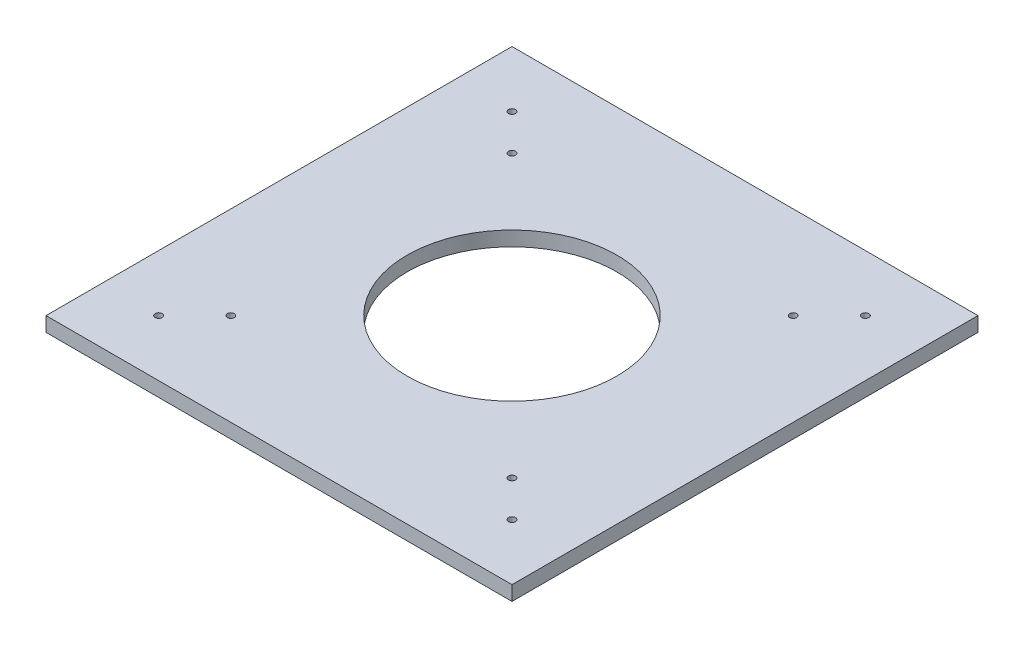
ISO-10303-21;
HEADER;
FILE_DESCRIPTION(('STEP AP214'),'2;1');
FILE_NAME('part.step','',(''),(''),'','','');
FILE_SCHEMA(('AUTOMOTIVE_DESIGN { 1 0 10303 214 1 1 1 1 }'));
ENDSEC;
DATA;
#1=APPLICATION_CONTEXT('core data for automotive mechanical design processes');
#2=APPLICATION_PROTOCOL_DEFINITION('international standard','automotive_design',2000,#1);
#3=PRODUCT_CONTEXT('',#1,'mechanical');
#4=PRODUCT('Part','Part','',(#3));
#5=PRODUCT_RELATED_PRODUCT_CATEGORY('part','',(#4));
#6=PRODUCT_DEFINITION_FORMATION('','',#4);
#7=PRODUCT_DEFINITION_CONTEXT('part definition',#1,'design');
#8=PRODUCT_DEFINITION('design','',#6,#7);
#9=PRODUCT_DEFINITION_SHAPE('','',#8);
#10=(LENGTH_UNIT() NAMED_UNIT(*) SI_UNIT(.MILLI.,.METRE.));
#11=(NAMED_UNIT(*) PLANE_ANGLE_UNIT() SI_UNIT($,.RADIAN.));
#12=(NAMED_UNIT(*) SI_UNIT($,.STERADIAN.) SOLID_ANGLE_UNIT());
#13=UNCERTAINTY_MEASURE_WITH_UNIT(LENGTH_MEASURE(1.E-05),#10,'distance_accuracy_value','');
#14=(GEOMETRIC_REPRESENTATION_CONTEXT(3) GLOBAL_UNCERTAINTY_ASSIGNED_CONTEXT((#13)) GLOBAL_UNIT_ASSIGNED_CONTEXT((#10,
#11,#12)) REPRESENTATION_CONTEXT('',''));
#15=CARTESIAN_POINT('',(0.,0.,0.));
#16=DIRECTION('',(0.,0.,1.));
#17=DIRECTION('',(1.,0.,0.));
#18=AXIS2_PLACEMENT_3D('',#15,#16,#17);
#19=CARTESIAN_POINT('',(0.,5.,0.));
#20=DIRECTION('',(0.,-1.,0.));
#21=DIRECTION('',(0.,0.,-1.));
#22=AXIS2_PLACEMENT_3D('',#19,#20,#21);
#23=PLANE('',#22);
#24=DIRECTION('',(0.,0.,-1.));
#25=VECTOR('',#24,1.);
#26=CARTESIAN_POINT('',(80.,5.,80.));
#27=LINE('',#26,#25);
#28=CARTESIAN_POINT('',(80.,5.,80.));
#29=VERTEX_POINT('',#28);
#30=CARTESIAN_POINT('',(80.,5.,-80.));
#31=VERTEX_POINT('',#30);
#32=EDGE_CURVE('E85',#29,#31,#27,.T.);
#33=ORIENTED_EDGE('',*,*,#32,.T.);
#34=DIRECTION('',(-1.,0.,0.));
#35=VECTOR('',#34,1.);
#36=CARTESIAN_POINT('',(-80.,5.,-80.));
#37=LINE('',#36,#35);
#38=CARTESIAN_POINT('',(-80.,5.,-80.));
#39=VERTEX_POINT('',#38);
#40=EDGE_CURVE('E80',#31,#39,#37,.T.);
#41=ORIENTED_EDGE('',*,*,#40,.T.);
#42=DIRECTION('',(0.,0.,1.));
#43=VECTOR('',#42,1.);
#44=CARTESIAN_POINT('',(-80.,5.,80.));
#45=LINE('',#44,#43);
#46=CARTESIAN_POINT('',(-80.,5.,80.));
#47=VERTEX_POINT('',#46);
#48=EDGE_CURVE('E83',#39,#47,#45,.T.);
#49=ORIENTED_EDGE('',*,*,#48,.T.);
#50=DIRECTION('',(1.,0.,0.));
#51=VECTOR('',#50,1.);
#52=CARTESIAN_POINT('',(-80.,5.,80.));
#53=LINE('',#52,#51);
#54=EDGE_CURVE('E50',#47,#29,#53,.T.);
#55=ORIENTED_EDGE('',*,*,#54,.T.);
#56=EDGE_LOOP('',(#33,#41,#49,#55));
#57=FACE_BOUND('',#56,.T.);
#58=CARTESIAN_POINT('',(-60.6642066420664,5.,-60.6642066420664));
#59=DIRECTION('',(0.,1.,0.));
#60=DIRECTION('',(0.,0.,1.));
#61=AXIS2_PLACEMENT_3D('',#58,#59,#60);
#62=CIRCLE('',#61,1.2);
#63=CARTESIAN_POINT('',(-60.6642066420664,5.,-59.4642066420664));
#64=VERTEX_POINT('',#63);
#65=EDGE_CURVE('E100',#64,#64,#62,.T.);
#66=ORIENTED_EDGE('',*,*,#65,.F.);
#67=EDGE_LOOP('',(#66));
#68=FACE_BOUND('',#67,.T.);
#69=CARTESIAN_POINT('',(-48.2795521345399,5.,-48.2795521345399));
#70=DIRECTION('',(0.,1.,0.));
#71=DIRECTION('',(0.,0.,1.));
#72=AXIS2_PLACEMENT_3D('',#69,#70,#71);
#73=CIRCLE('',#72,1.2);
#74=CARTESIAN_POINT('',(-48.2795521345399,5.,-47.0795521345399));
#75=VERTEX_POINT('',#74);
#76=EDGE_CURVE('E115',#75,#75,#73,.T.);
#77=ORIENTED_EDGE('',*,*,#76,.F.);
#78=EDGE_LOOP('',(#77));
#79=FACE_BOUND('',#78,.T.);
#80=CARTESIAN_POINT('',(48.2795521345399,5.,-48.2795521345399));
#81=DIRECTION('',(0.,1.,0.));
#82=DIRECTION('',(0.,0.,-1.));
#83=AXIS2_PLACEMENT_3D('',#80,#81,#82);
#84=CIRCLE('',#83,1.2);
#85=CARTESIAN_POINT('',(48.2795521345399,5.,-49.4795521345399));
#86=VERTEX_POINT('',#85);
#87=EDGE_CURVE('E121',#86,#86,#84,.T.);
#88=ORIENTED_EDGE('',*,*,#87,.F.);
#89=EDGE_LOOP('',(#88));
#90=FACE_BOUND('',#89,.T.);
#91=CARTESIAN_POINT('',(60.6642066420665,5.,-60.6642066420664));
#92=DIRECTION('',(0.,1.,0.));
#93=DIRECTION('',(0.,0.,-1.));
#94=AXIS2_PLACEMENT_3D('',#91,#92,#93);
#95=CIRCLE('',#94,1.2);
#96=CARTESIAN_POINT('',(60.6642066420665,5.,-61.8642066420664));
#97=VERTEX_POINT('',#96);
#98=EDGE_CURVE('E127',#97,#97,#95,.T.);
#99=ORIENTED_EDGE('',*,*,#98,.F.);
#100=EDGE_LOOP('',(#99));
#101=FACE_BOUND('',#100,.T.);
#102=CARTESIAN_POINT('',(60.6642066420665,5.,60.6642066420664));
#103=DIRECTION('',(0.,1.,0.));
#104=DIRECTION('',(0.,0.,1.));
#105=AXIS2_PLACEMENT_3D('',#102,#103,#104);
#106=CIRCLE('',#105,1.2);
#107=CARTESIAN_POINT('',(60.6642066420665,5.,61.8642066420664));
#108=VERTEX_POINT('',#107);
#109=EDGE_CURVE('E133',#108,#108,#106,.T.);
#110=ORIENTED_EDGE('',*,*,#109,.F.);
#111=EDGE_LOOP('',(#110));
#112=FACE_BOUND('',#111,.T.);
#113=CARTESIAN_POINT('',(48.2795521345399,5.,48.2795521345398));
#114=DIRECTION('',(0.,1.,0.));
#115=DIRECTION('',(0.,0.,1.));
#116=AXIS2_PLACEMENT_3D('',#113,#114,#115);
#117=CIRCLE('',#116,1.2);
#118=CARTESIAN_POINT('',(48.2795521345399,5.,49.4795521345398));
#119=VERTEX_POINT('',#118);
#120=EDGE_CURVE('E139',#119,#119,#117,.T.);
#121=ORIENTED_EDGE('',*,*,#120,.F.);
#122=EDGE_LOOP('',(#121));
#123=FACE_BOUND('',#122,.T.);
#124=CARTESIAN_POINT('',(-48.2795521345399,5.,48.2795521345399));
#125=DIRECTION('',(0.,1.,0.));
#126=DIRECTION('',(0.,0.,-1.));
#127=AXIS2_PLACEMENT_3D('',#124,#125,#126);
#128=CIRCLE('',#127,1.2);
#129=CARTESIAN_POINT('',(-48.2795521345399,5.,47.0795521345399));
#130=VERTEX_POINT('',#129);
#131=EDGE_CURVE('E145',#130,#130,#128,.T.);
#132=ORIENTED_EDGE('',*,*,#131,.F.);
#133=EDGE_LOOP('',(#132));
#134=FACE_BOUND('',#133,.T.);
#135=CARTESIAN_POINT('',(-60.6642066420664,5.,60.6642066420664));
#136=DIRECTION('',(0.,1.,0.));
#137=DIRECTION('',(0.,0.,-1.));
#138=AXIS2_PLACEMENT_3D('',#135,#136,#137);
#139=CIRCLE('',#138,1.2);
#140=CARTESIAN_POINT('',(-60.6642066420664,5.,59.4642066420664));
#141=VERTEX_POINT('',#140);
#142=EDGE_CURVE('E151',#141,#141,#139,.T.);
#143=ORIENTED_EDGE('',*,*,#142,.F.);
#144=EDGE_LOOP('',(#143));
#145=FACE_BOUND('',#144,.T.);
#146=CARTESIAN_POINT('',(0.,5.,0.));
#147=DIRECTION('',(0.,1.,0.));
#148=DIRECTION('',(0.,0.,1.));
#149=AXIS2_PLACEMENT_3D('',#146,#147,#148);
#150=CIRCLE('',#149,36.);
#151=CARTESIAN_POINT('',(0.,5.,36.));
#152=VERTEX_POINT('',#151);
#153=EDGE_CURVE('E157',#152,#152,#150,.T.);
#154=ORIENTED_EDGE('',*,*,#153,.F.);
#155=EDGE_LOOP('',(#154));
#156=FACE_BOUND('',#155,.T.);
#157=ADVANCED_FACE('F33',(#57,#68,#79,#90,#101,#112,#123,#134,#145,#156),#23,.F.);
#158=CARTESIAN_POINT('',(0.,0.,0.));
#159=DIRECTION('',(0.,-1.,0.));
#160=DIRECTION('',(0.,0.,-1.));
#161=AXIS2_PLACEMENT_3D('',#158,#159,#160);
#162=PLANE('',#161);
#163=CARTESIAN_POINT('',(-60.6642066420664,0.,60.6642066420664));
#164=DIRECTION('',(0.,1.,0.));
#165=DIRECTION('',(0.,0.,-1.));
#166=AXIS2_PLACEMENT_3D('',#163,#164,#165);
#167=CIRCLE('',#166,1.2);
#168=CARTESIAN_POINT('',(-60.6642066420664,0.,59.4642066420664));
#169=VERTEX_POINT('',#168);
#170=EDGE_CURVE('E154',#169,#169,#167,.T.);
#171=ORIENTED_EDGE('',*,*,#170,.T.);
#172=EDGE_LOOP('',(#171));
#173=FACE_BOUND('',#172,.T.);
#174=CARTESIAN_POINT('',(48.2795521345399,0.,48.2795521345398));
#175=DIRECTION('',(0.,1.,0.));
#176=DIRECTION('',(0.,0.,1.));
#177=AXIS2_PLACEMENT_3D('',#174,#175,#176);
#178=CIRCLE('',#177,1.2);
#179=CARTESIAN_POINT('',(48.2795521345399,0.,49.4795521345398));
#180=VERTEX_POINT('',#179);
#181=EDGE_CURVE('E142',#180,#180,#178,.T.);
#182=ORIENTED_EDGE('',*,*,#181,.T.);
#183=EDGE_LOOP('',(#182));
#184=FACE_BOUND('',#183,.T.);
#185=CARTESIAN_POINT('',(60.6642066420665,0.,-60.6642066420664));
#186=DIRECTION('',(0.,1.,0.));
#187=DIRECTION('',(0.,0.,-1.));
#188=AXIS2_PLACEMENT_3D('',#185,#186,#187);
#189=CIRCLE('',#188,1.2);
#190=CARTESIAN_POINT('',(60.6642066420665,0.,-61.8642066420664));
#191=VERTEX_POINT('',#190);
#192=EDGE_CURVE('E130',#191,#191,#189,.T.);
#193=ORIENTED_EDGE('',*,*,#192,.T.);
#194=EDGE_LOOP('',(#193));
#195=FACE_BOUND('',#194,.T.);
#196=CARTESIAN_POINT('',(-48.2795521345399,0.,-48.2795521345399));
#197=DIRECTION('',(0.,1.,0.));
#198=DIRECTION('',(0.,0.,1.));
#199=AXIS2_PLACEMENT_3D('',#196,#197,#198);
#200=CIRCLE('',#199,1.2);
#201=CARTESIAN_POINT('',(-48.2795521345399,0.,-47.0795521345399));
#202=VERTEX_POINT('',#201);
#203=EDGE_CURVE('E118',#202,#202,#200,.T.);
#204=ORIENTED_EDGE('',*,*,#203,.T.);
#205=EDGE_LOOP('',(#204));
#206=FACE_BOUND('',#205,.T.);
#207=DIRECTION('',(0.,0.,-1.));
#208=VECTOR('',#207,1.);
#209=CARTESIAN_POINT('',(80.,0.,80.));
#210=LINE('',#209,#208);
#211=CARTESIAN_POINT('',(80.,0.,80.));
#212=VERTEX_POINT('',#211);
#213=CARTESIAN_POINT('',(80.,0.,-80.));
#214=VERTEX_POINT('',#213);
#215=EDGE_CURVE('E97',#212,#214,#210,.T.);
#216=ORIENTED_EDGE('',*,*,#215,.F.);
#217=DIRECTION('',(1.,0.,0.));
#218=VECTOR('',#217,1.);
#219=CARTESIAN_POINT('',(-80.,0.,80.));
#220=LINE('',#219,#218);
#221=CARTESIAN_POINT('',(-80.,0.,80.));
#222=VERTEX_POINT('',#221);
#223=EDGE_CURVE('E73',#222,#212,#220,.T.);
#224=ORIENTED_EDGE('',*,*,#223,.F.);
#225=DIRECTION('',(0.,0.,1.));
#226=VECTOR('',#225,1.);
#227=CARTESIAN_POINT('',(-80.,0.,80.));
#228=LINE('',#227,#226);
#229=CARTESIAN_POINT('',(-80.,0.,-80.));
#230=VERTEX_POINT('',#229);
#231=EDGE_CURVE('E67',#230,#222,#228,.T.);
#232=ORIENTED_EDGE('',*,*,#231,.F.);
#233=DIRECTION('',(-1.,0.,0.));
#234=VECTOR('',#233,1.);
#235=CARTESIAN_POINT('',(-80.,0.,-80.));
#236=LINE('',#235,#234);
#237=EDGE_CURVE('E89',#214,#230,#236,.T.);
#238=ORIENTED_EDGE('',*,*,#237,.F.);
#239=EDGE_LOOP('',(#216,#224,#232,#238));
#240=FACE_BOUND('',#239,.T.);
#241=CARTESIAN_POINT('',(-60.6642066420664,0.,-60.6642066420664));
#242=DIRECTION('',(0.,1.,0.));
#243=DIRECTION('',(0.,0.,1.));
#244=AXIS2_PLACEMENT_3D('',#241,#242,#243);
#245=CIRCLE('',#244,1.2);
#246=CARTESIAN_POINT('',(-60.6642066420664,0.,-59.4642066420664));
#247=VERTEX_POINT('',#246);
#248=EDGE_CURVE('E112',#247,#247,#245,.T.);
#249=ORIENTED_EDGE('',*,*,#248,.T.);
#250=EDGE_LOOP('',(#249));
#251=FACE_BOUND('',#250,.T.);
#252=CARTESIAN_POINT('',(48.2795521345399,0.,-48.2795521345399));
#253=DIRECTION('',(0.,1.,0.));
#254=DIRECTION('',(0.,0.,-1.));
#255=AXIS2_PLACEMENT_3D('',#252,#253,#254);
#256=CIRCLE('',#255,1.2);
#257=CARTESIAN_POINT('',(48.2795521345399,0.,-49.4795521345399));
#258=VERTEX_POINT('',#257);
#259=EDGE_CURVE('E124',#258,#258,#256,.T.);
#260=ORIENTED_EDGE('',*,*,#259,.T.);
#261=EDGE_LOOP('',(#260));
#262=FACE_BOUND('',#261,.T.);
#263=CARTESIAN_POINT('',(60.6642066420665,0.,60.6642066420664));
#264=DIRECTION('',(0.,1.,0.));
#265=DIRECTION('',(0.,0.,1.));
#266=AXIS2_PLACEMENT_3D('',#263,#264,#265);
#267=CIRCLE('',#266,1.2);
#268=CARTESIAN_POINT('',(60.6642066420665,0.,61.8642066420664));
#269=VERTEX_POINT('',#268);
#270=EDGE_CURVE('E136',#269,#269,#267,.T.);
#271=ORIENTED_EDGE('',*,*,#270,.T.);
#272=EDGE_LOOP('',(#271));
#273=FACE_BOUND('',#272,.T.);
#274=CARTESIAN_POINT('',(-48.2795521345399,0.,48.2795521345399));
#275=DIRECTION('',(0.,1.,0.));
#276=DIRECTION('',(0.,0.,-1.));
#277=AXIS2_PLACEMENT_3D('',#274,#275,#276);
#278=CIRCLE('',#277,1.2);
#279=CARTESIAN_POINT('',(-48.2795521345399,0.,47.0795521345399));
#280=VERTEX_POINT('',#279);
#281=EDGE_CURVE('E148',#280,#280,#278,.T.);
#282=ORIENTED_EDGE('',*,*,#281,.T.);
#283=EDGE_LOOP('',(#282));
#284=FACE_BOUND('',#283,.T.);
#285=CARTESIAN_POINT('',(0.,0.,0.));
#286=DIRECTION('',(0.,1.,0.));
#287=DIRECTION('',(0.,0.,1.));
#288=AXIS2_PLACEMENT_3D('',#285,#286,#287);
#289=CIRCLE('',#288,36.);
#290=CARTESIAN_POINT('',(0.,0.,36.));
#291=VERTEX_POINT('',#290);
#292=EDGE_CURVE('E160',#291,#291,#289,.T.);
#293=ORIENTED_EDGE('',*,*,#292,.T.);
#294=EDGE_LOOP('',(#293));
#295=FACE_BOUND('',#294,.T.);
#296=ADVANCED_FACE('F108',(#173,#184,#195,#206,#240,#251,#262,#273,#284,#295),#162,.T.);
#297=CARTESIAN_POINT('',(80.,5.,80.));
#298=DIRECTION('',(-1.,0.,0.));
#299=DIRECTION('',(0.,0.,1.));
#300=AXIS2_PLACEMENT_3D('',#297,#298,#299);
#301=PLANE('',#300);
#302=ORIENTED_EDGE('',*,*,#215,.T.);
#303=DIRECTION('',(0.,-1.,0.));
#304=VECTOR('',#303,1.);
#305=CARTESIAN_POINT('',(80.,5.,-80.));
#306=LINE('',#305,#304);
#307=EDGE_CURVE('E11',#31,#214,#306,.T.);
#308=ORIENTED_EDGE('',*,*,#307,.F.);
#309=ORIENTED_EDGE('',*,*,#32,.F.);
#310=DIRECTION('',(0.,-1.,0.));
#311=VECTOR('',#310,1.);
#312=CARTESIAN_POINT('',(80.,5.,80.));
#313=LINE('',#312,#311);
#314=EDGE_CURVE('E93',#29,#212,#313,.T.);
#315=ORIENTED_EDGE('',*,*,#314,.T.);
#316=EDGE_LOOP('',(#302,#308,#309,#315));
#317=FACE_BOUND('',#316,.T.);
#318=ADVANCED_FACE('F35',(#317),#301,.F.);
#319=CARTESIAN_POINT('',(-80.,5.,-80.));
#320=DIRECTION('',(0.,0.,1.));
#321=DIRECTION('',(1.,0.,0.));
#322=AXIS2_PLACEMENT_3D('',#319,#320,#321);
#323=PLANE('',#322);
#324=ORIENTED_EDGE('',*,*,#237,.T.);
#325=DIRECTION('',(0.,-1.,0.));
#326=VECTOR('',#325,1.);
#327=CARTESIAN_POINT('',(-80.,5.,-80.));
#328=LINE('',#327,#326);
#329=EDGE_CURVE('E42',#39,#230,#328,.T.);
#330=ORIENTED_EDGE('',*,*,#329,.F.);
#331=ORIENTED_EDGE('',*,*,#40,.F.);
#332=ORIENTED_EDGE('',*,*,#307,.T.);
#333=EDGE_LOOP('',(#324,#330,#331,#332));
#334=FACE_BOUND('',#333,.T.);
#335=ADVANCED_FACE('F88',(#334),#323,.F.);
#336=CARTESIAN_POINT('',(-80.,5.,80.));
#337=DIRECTION('',(1.,0.,0.));
#338=DIRECTION('',(0.,0.,-1.));
#339=AXIS2_PLACEMENT_3D('',#336,#337,#338);
#340=PLANE('',#339);
#341=ORIENTED_EDGE('',*,*,#231,.T.);
#342=DIRECTION('',(0.,-1.,0.));
#343=VECTOR('',#342,1.);
#344=CARTESIAN_POINT('',(-80.,5.,80.));
#345=LINE('',#344,#343);
#346=EDGE_CURVE('E90',#47,#222,#345,.T.);
#347=ORIENTED_EDGE('',*,*,#346,.F.);
#348=ORIENTED_EDGE('',*,*,#48,.F.);
#349=ORIENTED_EDGE('',*,*,#329,.T.);
#350=EDGE_LOOP('',(#341,#347,#348,#349));
#351=FACE_BOUND('',#350,.T.);
#352=ADVANCED_FACE('F91',(#351),#340,.F.);
#353=CARTESIAN_POINT('',(-80.,5.,80.));
#354=DIRECTION('',(0.,0.,-1.));
#355=DIRECTION('',(-1.,0.,0.));
#356=AXIS2_PLACEMENT_3D('',#353,#354,#355);
#357=PLANE('',#356);
#358=ORIENTED_EDGE('',*,*,#223,.T.);
#359=ORIENTED_EDGE('',*,*,#314,.F.);
#360=ORIENTED_EDGE('',*,*,#54,.F.);
#361=ORIENTED_EDGE('',*,*,#346,.T.);
#362=EDGE_LOOP('',(#358,#359,#360,#361));
#363=FACE_BOUND('',#362,.T.);
#364=ADVANCED_FACE('F105',(#363),#357,.F.);
#365=CARTESIAN_POINT('',(-60.6642066420664,5.,-60.6642066420664));
#366=DIRECTION('',(0.,-1.,0.));
#367=DIRECTION('',(0.,0.,-1.));
#368=AXIS2_PLACEMENT_3D('',#365,#366,#367);
#369=CYLINDRICAL_SURFACE('',#368,1.2);
#370=ORIENTED_EDGE('',*,*,#65,.T.);
#371=EDGE_LOOP('',(#370));
#372=FACE_BOUND('',#371,.T.);
#373=ORIENTED_EDGE('',*,*,#248,.F.);
#374=EDGE_LOOP('',(#373));
#375=FACE_BOUND('',#374,.T.);
#376=ADVANCED_FACE('F177',(#372,#375),#369,.F.);
#377=CARTESIAN_POINT('',(-48.2795521345399,5.,-48.2795521345399));
#378=DIRECTION('',(0.,-1.,0.));
#379=DIRECTION('',(0.,0.,-1.));
#380=AXIS2_PLACEMENT_3D('',#377,#378,#379);
#381=CYLINDRICAL_SURFACE('',#380,1.2);
#382=ORIENTED_EDGE('',*,*,#76,.T.);
#383=EDGE_LOOP('',(#382));
#384=FACE_BOUND('',#383,.T.);
#385=ORIENTED_EDGE('',*,*,#203,.F.);
#386=EDGE_LOOP('',(#385));
#387=FACE_BOUND('',#386,.T.);
#388=ADVANCED_FACE('F223',(#384,#387),#381,.F.);
#389=CARTESIAN_POINT('',(48.2795521345399,5.,-48.2795521345399));
#390=DIRECTION('',(0.,-1.,0.));
#391=DIRECTION('',(0.,0.,-1.));
#392=AXIS2_PLACEMENT_3D('',#389,#390,#391);
#393=CYLINDRICAL_SURFACE('',#392,1.2);
#394=ORIENTED_EDGE('',*,*,#87,.T.);
#395=EDGE_LOOP('',(#394));
#396=FACE_BOUND('',#395,.T.);
#397=ORIENTED_EDGE('',*,*,#259,.F.);
#398=EDGE_LOOP('',(#397));
#399=FACE_BOUND('',#398,.T.);
#400=ADVANCED_FACE('F231',(#396,#399),#393,.F.);
#401=CARTESIAN_POINT('',(60.6642066420665,5.,-60.6642066420664));
#402=DIRECTION('',(0.,-1.,0.));
#403=DIRECTION('',(0.,0.,-1.));
#404=AXIS2_PLACEMENT_3D('',#401,#402,#403);
#405=CYLINDRICAL_SURFACE('',#404,1.2);
#406=ORIENTED_EDGE('',*,*,#98,.T.);
#407=EDGE_LOOP('',(#406));
#408=FACE_BOUND('',#407,.T.);
#409=ORIENTED_EDGE('',*,*,#192,.F.);
#410=EDGE_LOOP('',(#409));
#411=FACE_BOUND('',#410,.T.);
#412=ADVANCED_FACE('F239',(#408,#411),#405,.F.);
#413=CARTESIAN_POINT('',(60.6642066420665,5.,60.6642066420664));
#414=DIRECTION('',(0.,-1.,0.));
#415=DIRECTION('',(0.,0.,-1.));
#416=AXIS2_PLACEMENT_3D('',#413,#414,#415);
#417=CYLINDRICAL_SURFACE('',#416,1.2);
#418=ORIENTED_EDGE('',*,*,#109,.T.);
#419=EDGE_LOOP('',(#418));
#420=FACE_BOUND('',#419,.T.);
#421=ORIENTED_EDGE('',*,*,#270,.F.);
#422=EDGE_LOOP('',(#421));
#423=FACE_BOUND('',#422,.T.);
#424=ADVANCED_FACE('F248',(#420,#423),#417,.F.);
#425=CARTESIAN_POINT('',(48.2795521345399,5.,48.2795521345398));
#426=DIRECTION('',(0.,-1.,0.));
#427=DIRECTION('',(0.,0.,-1.));
#428=AXIS2_PLACEMENT_3D('',#425,#426,#427);
#429=CYLINDRICAL_SURFACE('',#428,1.2);
#430=ORIENTED_EDGE('',*,*,#120,.T.);
#431=EDGE_LOOP('',(#430));
#432=FACE_BOUND('',#431,.T.);
#433=ORIENTED_EDGE('',*,*,#181,.F.);
#434=EDGE_LOOP('',(#433));
#435=FACE_BOUND('',#434,.T.);
#436=ADVANCED_FACE('F257',(#432,#435),#429,.F.);
#437=CARTESIAN_POINT('',(-48.2795521345399,5.,48.2795521345399));
#438=DIRECTION('',(0.,-1.,0.));
#439=DIRECTION('',(0.,0.,-1.));
#440=AXIS2_PLACEMENT_3D('',#437,#438,#439);
#441=CYLINDRICAL_SURFACE('',#440,1.2);
#442=ORIENTED_EDGE('',*,*,#131,.T.);
#443=EDGE_LOOP('',(#442));
#444=FACE_BOUND('',#443,.T.);
#445=ORIENTED_EDGE('',*,*,#281,.F.);
#446=EDGE_LOOP('',(#445));
#447=FACE_BOUND('',#446,.T.);
#448=ADVANCED_FACE('F266',(#444,#447),#441,.F.);
#449=CARTESIAN_POINT('',(-60.6642066420664,5.,60.6642066420664));
#450=DIRECTION('',(0.,-1.,0.));
#451=DIRECTION('',(0.,0.,-1.));
#452=AXIS2_PLACEMENT_3D('',#449,#450,#451);
#453=CYLINDRICAL_SURFACE('',#452,1.2);
#454=ORIENTED_EDGE('',*,*,#142,.T.);
#455=EDGE_LOOP('',(#454));
#456=FACE_BOUND('',#455,.T.);
#457=ORIENTED_EDGE('',*,*,#170,.F.);
#458=EDGE_LOOP('',(#457));
#459=FACE_BOUND('',#458,.T.);
#460=ADVANCED_FACE('F275',(#456,#459),#453,.F.);
#461=CARTESIAN_POINT('',(0.,5.,0.));
#462=DIRECTION('',(0.,-1.,0.));
#463=DIRECTION('',(0.,0.,-1.));
#464=AXIS2_PLACEMENT_3D('',#461,#462,#463);
#465=CYLINDRICAL_SURFACE('',#464,36.);
#466=ORIENTED_EDGE('',*,*,#153,.T.);
#467=EDGE_LOOP('',(#466));
#468=FACE_BOUND('',#467,.T.);
#469=ORIENTED_EDGE('',*,*,#292,.F.);
#470=EDGE_LOOP('',(#469));
#471=FACE_BOUND('',#470,.T.);
#472=ADVANCED_FACE('F166',(#468,#471),#465,.F.);
#473=CLOSED_SHELL('',(#157,#296,#318,#335,#352,#364,#376,#388,#400,#412,#424,#436,#448,#460,#472));
#474=MANIFOLD_SOLID_BREP('B2',#473);
#475=ADVANCED_BREP_SHAPE_REPRESENTATION('',(#18,#474),#14);
#476=SHAPE_DEFINITION_REPRESENTATION(#9,#475);
ENDSEC;
END-ISO-10303-21;
